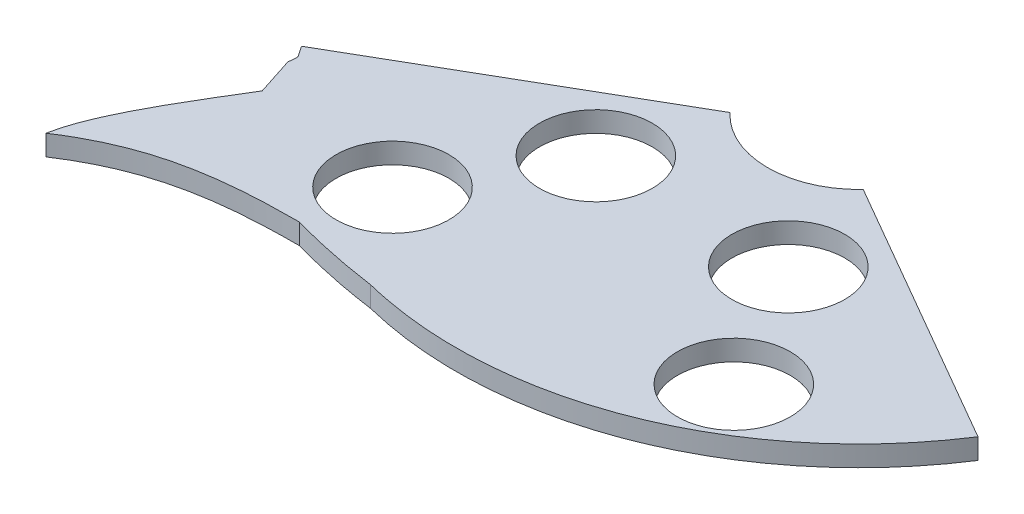
ISO-10303-21;
HEADER;
FILE_DESCRIPTION(('STEP AP214'),'2;1');
FILE_NAME('part.step','',(''),(''),'','','');
FILE_SCHEMA(('AUTOMOTIVE_DESIGN { 1 0 10303 214 1 1 1 1 }'));
ENDSEC;
DATA;
#1=APPLICATION_CONTEXT('core data for automotive mechanical design processes');
#2=APPLICATION_PROTOCOL_DEFINITION('international standard','automotive_design',2000,#1);
#3=PRODUCT_CONTEXT('',#1,'mechanical');
#4=PRODUCT('Part','Part','',(#3));
#5=PRODUCT_RELATED_PRODUCT_CATEGORY('part','',(#4));
#6=PRODUCT_DEFINITION_FORMATION('','',#4);
#7=PRODUCT_DEFINITION_CONTEXT('part definition',#1,'design');
#8=PRODUCT_DEFINITION('design','',#6,#7);
#9=PRODUCT_DEFINITION_SHAPE('','',#8);
#10=(LENGTH_UNIT() NAMED_UNIT(*) SI_UNIT(.MILLI.,.METRE.));
#11=(NAMED_UNIT(*) PLANE_ANGLE_UNIT() SI_UNIT($,.RADIAN.));
#12=(NAMED_UNIT(*) SI_UNIT($,.STERADIAN.) SOLID_ANGLE_UNIT());
#13=UNCERTAINTY_MEASURE_WITH_UNIT(LENGTH_MEASURE(1.E-05),#10,'distance_accuracy_value','');
#14=(GEOMETRIC_REPRESENTATION_CONTEXT(3) GLOBAL_UNCERTAINTY_ASSIGNED_CONTEXT((#13)) GLOBAL_UNIT_ASSIGNED_CONTEXT((#10,
#11,#12)) REPRESENTATION_CONTEXT('',''));
#15=CARTESIAN_POINT('',(0.,0.,0.));
#16=DIRECTION('',(0.,0.,1.));
#17=DIRECTION('',(1.,0.,0.));
#18=AXIS2_PLACEMENT_3D('',#15,#16,#17);
#19=CARTESIAN_POINT('',(-6.86546308041866,-119.736,79.1435924727805));
#20=DIRECTION('',(0.,1.,0.));
#21=DIRECTION('',(0.,0.,1.));
#22=AXIS2_PLACEMENT_3D('',#19,#20,#21);
#23=PLANE('',#22);
#24=CARTESIAN_POINT('',(18.75,-119.736,32.476));
#25=DIRECTION('',(0.,-1.,0.));
#26=DIRECTION('',(0.,0.,-1.));
#27=AXIS2_PLACEMENT_3D('',#24,#25,#26);
#28=CIRCLE('',#27,10.999845998306);
#29=CARTESIAN_POINT('',(18.75,-119.736,21.476154001694));
#30=VERTEX_POINT('',#29);
#31=EDGE_CURVE('E354',#30,#30,#28,.T.);
#32=ORIENTED_EDGE('',*,*,#31,.F.);
#33=EDGE_LOOP('',(#32));
#34=FACE_BOUND('',#33,.T.);
#35=CARTESIAN_POINT('',(-33.25,-119.736,57.591));
#36=DIRECTION('',(0.,-1.,0.));
#37=DIRECTION('',(0.,0.,-1.));
#38=AXIS2_PLACEMENT_3D('',#35,#36,#37);
#39=CIRCLE('',#38,10.999845998306);
#40=CARTESIAN_POINT('',(-33.25,-119.736,46.591154001694));
#41=VERTEX_POINT('',#40);
#42=EDGE_CURVE('E342',#41,#41,#39,.T.);
#43=ORIENTED_EDGE('',*,*,#42,.F.);
#44=EDGE_LOOP('',(#43));
#45=FACE_BOUND('',#44,.T.);
#46=CARTESIAN_POINT('',(-36.4339766689748,-119.736,72.5288613154324));
#47=CARTESIAN_POINT('',(-36.090208175183,-119.736,72.6263250061463));
#48=CARTESIAN_POINT('',(-35.408990523024,-119.736,72.8194627748375));
#49=CARTESIAN_POINT('',(-34.3931059077447,-119.736,73.0944276072982));
#50=CARTESIAN_POINT('',(-33.3936868057941,-119.736,73.3559917423255));
#51=CARTESIAN_POINT('',(-32.410542619546,-119.736,73.6039334399726));
#52=CARTESIAN_POINT('',(-31.4439380081778,-119.736,73.8390468102347));
#53=CARTESIAN_POINT('',(-30.4940427731053,-119.736,74.0618251975522));
#54=CARTESIAN_POINT('',(-29.5610306157385,-119.736,74.2728215662708));
#55=CARTESIAN_POINT('',(-28.6450505128176,-119.736,74.4725604284145));
#56=CARTESIAN_POINT('',(-27.2570964212587,-119.736,74.7643917010507));
#57=CARTESIAN_POINT('',(-25.4225580165016,-119.736,75.1251546210476));
#58=CARTESIAN_POINT('',(-23.1665530380868,-119.736,75.5277459715398));
#59=CARTESIAN_POINT('',(-21.0102525580803,-119.736,75.8799513365268));
#60=CARTESIAN_POINT('',(-19.6041873278216,-119.736,76.0856738966707));
#61=CARTESIAN_POINT('',(-18.9186222511044,-119.736,76.1859794971462));
#62=B_SPLINE_CURVE_WITH_KNOTS('',3,(#46,#47,#48,#49,#50,#51,#52,#53,#54,#55,#56,#57,#58,#59,#60,
#61),.UNSPECIFIED.,.F.,.F.,(4,1,1,1,1,1,1,1,1,1,1,1,1,4),(2.38063851926255,2.44050089938185,
2.49926294797482,2.5569538335641,2.61357512474572,2.66912775865728,2.72361265224791,
2.77703104951304,2.82938450515035,2.88067486393888,3.01464333689576,3.14259742661856,
3.26458921158804,3.38066594991599),.UNSPECIFIED.);
#63=CARTESIAN_POINT('',(-18.9186223045553,-119.736,76.1859798624701));
#64=VERTEX_POINT('',#63);
#65=CARTESIAN_POINT('',(-36.4339766689781,-119.736,72.5288613154428));
#66=VERTEX_POINT('',#65);
#67=EDGE_CURVE('E311',#64,#66,#62,.F.);
#68=ORIENTED_EDGE('',*,*,#67,.T.);
#69=CARTESIAN_POINT('',(-76.1196037393779,-119.736,82.2367438406873));
#70=CARTESIAN_POINT('',(-75.6828937378349,-119.736,81.95336389176));
#71=CARTESIAN_POINT('',(-74.8176335983295,-119.736,81.3918989075016));
#72=CARTESIAN_POINT('',(-73.5052892979913,-119.736,80.5994530897051));
#73=CARTESIAN_POINT('',(-72.1987972246835,-119.736,79.8533061057026));
#74=CARTESIAN_POINT('',(-70.8969004631714,-119.736,79.1556188350504));
#75=CARTESIAN_POINT('',(-69.1650589389726,-119.736,78.2860553036223));
#76=CARTESIAN_POINT('',(-66.9757792636594,-119.736,77.2968295051953));
#77=CARTESIAN_POINT('',(-64.5921226750194,-119.736,76.375802528738));
#78=CARTESIAN_POINT('',(-62.4758692427193,-119.736,75.6678444736838));
#79=CARTESIAN_POINT('',(-59.7691651247279,-119.736,74.8672994946677));
#80=CARTESIAN_POINT('',(-56.0797246277077,-119.736,74.0068584321123));
#81=CARTESIAN_POINT('',(-51.4518642525688,-119.736,73.2789993283885));
#82=CARTESIAN_POINT('',(-46.7344340591599,-119.736,72.8232235757387));
#83=CARTESIAN_POINT('',(-43.1390482250861,-119.736,72.6447150892472));
#84=CARTESIAN_POINT('',(-40.6152740970454,-119.736,72.5747252669947));
#85=CARTESIAN_POINT('',(-39.2284313702309,-119.736,72.548620009672));
#86=CARTESIAN_POINT('',(-37.8337690875411,-119.736,72.5327655940466));
#87=CARTESIAN_POINT('',(-36.9013995312553,-119.736,72.5301648831771));
#88=CARTESIAN_POINT('',(-36.4339766689781,-119.736,72.5288613154428));
#89=B_SPLINE_CURVE_WITH_KNOTS('',3,(#69,#70,#71,#72,#73,#74,#75,#76,#77,#78,#79,#80,#81,#82,#83,
#84,#85,#86,#87,#88),.UNSPECIFIED.,.F.,.F.,(4,1,1,1,1,1,1,1,1,1,1,1,1,1,1,1,1,4),
(4.0523179773988E-06,0.0376172160480558,0.074527583222547,0.110754227177039,0.14631713635095,
0.181237033424669,0.250761520637126,0.319805088134702,0.365778200716289,0.411965678661584,
0.523715454943786,0.639200259777468,0.750209078270335,0.866005219311951,0.899224498910965,
0.932632405241286,0.96622674597806,1.),.UNSPECIFIED.);
#90=CARTESIAN_POINT('',(-76.1196037393779,-119.736,82.2367438406873));
#91=VERTEX_POINT('',#90);
#92=EDGE_CURVE('E104',#66,#91,#89,.F.);
#93=ORIENTED_EDGE('',*,*,#92,.T.);
#94=CARTESIAN_POINT('',(1739.22194511142,-119.736,-754.255930200133));
#95=CARTESIAN_POINT('',(-154.307245408887,-119.736,204.961275522606));
#96=CARTESIAN_POINT('',(-108.258538955282,-119.736,129.504988917175));
#97=CARTESIAN_POINT('',(287.331492542449,-119.736,-518.716363945765));
#98=CARTESIAN_POINT('',(636.872787644068,-119.736,-1091.48147596822));
#99=CARTESIAN_POINT('',(993.135174404048,-119.736,-1644.086992798));
#100=B_SPLINE_CURVE_WITH_KNOTS('',3,(#94,#95,#96,#97,#98,#99),.UNSPECIFIED.,.F.,.F.,(4,2,4),
(-6.34847240769707,0.999520379785779,56.775834920548),.UNSPECIFIED.);
#101=CARTESIAN_POINT('',(-62.2008153900222,-119.736,54.0339267010098));
#102=VERTEX_POINT('',#101);
#103=EDGE_CURVE('E271',#91,#102,#100,.T.);
#104=ORIENTED_EDGE('',*,*,#103,.T.);
#105=DIRECTION('',(-0.30840493395437,0.,-0.951255169085877));
#106=VECTOR('',#105,1.);
#107=CARTESIAN_POINT('',(-64.6157246516883,-119.736,46.5852945129033));
#108=LINE('',#107,#106);
#109=CARTESIAN_POINT('',(-64.6157246516883,-119.736,46.5852945129033));
#110=VERTEX_POINT('',#109);
#111=EDGE_CURVE('E274',#102,#110,#108,.T.);
#112=ORIENTED_EDGE('',*,*,#111,.T.);
#113=CARTESIAN_POINT('',(-64.4649857011341,-119.736,44.7930857181058));
#114=CARTESIAN_POINT('',(-64.4606102922016,-119.736,44.8978814026132));
#115=CARTESIAN_POINT('',(-64.4521154530758,-119.736,45.1013418093316));
#116=CARTESIAN_POINT('',(-64.4541549973613,-119.736,45.397562552258));
#117=CARTESIAN_POINT('',(-64.4674830736292,-119.736,45.674976629803));
#118=CARTESIAN_POINT('',(-64.494116040828,-119.736,45.9507814122414));
#119=CARTESIAN_POINT('',(-64.5282137407988,-119.736,46.1820492350482));
#120=CARTESIAN_POINT('',(-64.5654974869257,-119.736,46.3749906839157));
#121=CARTESIAN_POINT('',(-64.5921209247604,-119.736,46.4933148461406));
#122=CARTESIAN_POINT('',(-64.6100461061515,-119.736,46.5631661969906));
#123=CARTESIAN_POINT('',(-64.6157246516883,-119.736,46.5852945129033));
#124=B_SPLINE_CURVE_WITH_KNOTS('',3,(#113,#114,#115,#116,#117,#118,#119,#120,#121,#122,#123),
.UNSPECIFIED.,.F.,.F.,(4,1,1,1,1,1,1,1,4),(2.85087836116027E-06,0.17425187068453,
0.338309317292824,0.491998190984157,0.635569251516564,0.798537306523809,0.880181233373115,
0.962042430276194,1.),.UNSPECIFIED.);
#125=CARTESIAN_POINT('',(-64.4649857011341,-119.736,44.7930857181058));
#126=VERTEX_POINT('',#125);
#127=EDGE_CURVE('E541',#110,#126,#124,.F.);
#128=ORIENTED_EDGE('',*,*,#127,.T.);
#129=CARTESIAN_POINT('',(0.507975725668061,-119.736,-0.345689997423168));
#130=DIRECTION('',(0.,-1.,0.));
#131=DIRECTION('',(0.,0.,-1.));
#132=AXIS2_PLACEMENT_3D('',#129,#130,#131);
#133=CIRCLE('',#132,79.1138090958701);
#134=CARTESIAN_POINT('',(-65.8942438215736,-119.736,42.6629141284689));
#135=VERTEX_POINT('',#134);
#136=EDGE_CURVE('E542',#126,#135,#133,.T.);
#137=ORIENTED_EDGE('',*,*,#136,.T.);
#138=DIRECTION('',(0.866025113443951,0.,-0.500000502884138));
#139=VECTOR('',#138,1.);
#140=CARTESIAN_POINT('',(-65.8942438215736,-119.736,42.6629141284688));
#141=LINE('',#140,#139);
#142=CARTESIAN_POINT('',(-12.9766531358799,-119.736,12.1108879302399));
#143=VERTEX_POINT('',#142);
#144=EDGE_CURVE('E130',#135,#143,#141,.T.);
#145=ORIENTED_EDGE('',*,*,#144,.T.);
#146=CARTESIAN_POINT('',(0.,-119.736,0.));
#147=DIRECTION('',(0.,1.,0.));
#148=DIRECTION('',(0.,0.,-1.));
#149=AXIS2_PLACEMENT_3D('',#146,#147,#148);
#150=CIRCLE('',#149,17.7501305084715);
#151=CARTESIAN_POINT('',(12.9766531358511,-119.736,12.1108879302707));
#152=VERTEX_POINT('',#151);
#153=EDGE_CURVE('E124',#143,#152,#150,.T.);
#154=ORIENTED_EDGE('',*,*,#153,.T.);
#155=DIRECTION('',(0.866025113442766,0.,0.500000502886192));
#156=VECTOR('',#155,1.);
#157=CARTESIAN_POINT('',(12.9766531358511,-119.736,12.1108879302707));
#158=LINE('',#157,#156);
#159=CARTESIAN_POINT('',(65.8946490574718,-119.736,42.6631480920523));
#160=VERTEX_POINT('',#159);
#161=EDGE_CURVE('E128',#152,#160,#158,.T.);
#162=ORIENTED_EDGE('',*,*,#161,.T.);
#163=CARTESIAN_POINT('',(-18.9186223045553,-119.736,76.1859798624701));
#164=CARTESIAN_POINT('',(-14.9832227890763,-119.736,77.1628806890219));
#165=CARTESIAN_POINT('',(-10.9726298568028,-119.736,77.8348403233372));
#166=CARTESIAN_POINT('',(-2.89512740354942,-119.736,78.5505067471803));
#167=CARTESIAN_POINT('',(1.17241069622407,-119.736,78.5954395830755));
#168=CARTESIAN_POINT('',(9.26266788773931,-119.736,78.0571524350515));
#169=CARTESIAN_POINT('',(13.287983703516,-119.736,77.4729968460706));
#170=CARTESIAN_POINT('',(21.198608359174,-119.736,75.6924384552704));
#171=CARTESIAN_POINT('',(25.0856213113476,-119.736,74.4945528880355));
#172=CARTESIAN_POINT('',(30.7415469371937,-119.736,72.2594617579058));
#173=CARTESIAN_POINT('',(32.5972796978839,-119.736,71.4415633457186));
#174=CARTESIAN_POINT('',(36.2401592680733,-119.736,69.6632416440962));
#175=CARTESIAN_POINT('',(38.0287408030914,-119.736,68.702535587141));
#176=CARTESIAN_POINT('',(41.5256045567289,-119.736,66.6480288365306));
#177=CARTESIAN_POINT('',(43.2324168863246,-119.736,65.554334245886));
#178=CARTESIAN_POINT('',(46.5573871242671,-119.736,63.2352693899852));
#179=CARTESIAN_POINT('',(48.1763106057289,-119.736,62.0102898455667));
#180=CARTESIAN_POINT('',(52.8826504928614,-119.736,58.1562168038565));
#181=CARTESIAN_POINT('',(55.8195127662942,-119.736,55.3443694066233));
#182=CARTESIAN_POINT('',(61.2240291270316,-119.736,49.2997534300691));
#183=CARTESIAN_POINT('',(63.6911393727187,-119.736,46.0668428001472));
#184=CARTESIAN_POINT('',(65.8946490574718,-119.736,42.6631480920523));
#185=B_SPLINE_CURVE_WITH_KNOTS('',3,(#163,#164,#165,#166,#167,#168,#169,#170,#171,#172,#173,
#174,#175,#176,#177,#178,#179,#180,#181,#182,#183,#184),.UNSPECIFIED.,.F.,.F.,(4,2,2,2,2,2,2,2,
2,2,4),(0.,0.125,0.25,0.375,0.5,0.5625,0.625,0.6875,0.75,0.875,1.),.UNSPECIFIED.);
#186=EDGE_CURVE('E53',#160,#64,#185,.F.);
#187=ORIENTED_EDGE('',*,*,#186,.T.);
#188=EDGE_LOOP('',(#68,#93,#104,#112,#128,#137,#145,#154,#162,#187));
#189=FACE_BOUND('',#188,.T.);
#190=CARTESIAN_POINT('',(33.25,-119.736,57.591));
#191=DIRECTION('',(0.,-1.,0.));
#192=DIRECTION('',(0.,0.,-1.));
#193=AXIS2_PLACEMENT_3D('',#190,#191,#192);
#194=CIRCLE('',#193,10.999845998306);
#195=CARTESIAN_POINT('',(33.25,-119.736,46.591154001694));
#196=VERTEX_POINT('',#195);
#197=EDGE_CURVE('E349',#196,#196,#194,.T.);
#198=ORIENTED_EDGE('',*,*,#197,.F.);
#199=EDGE_LOOP('',(#198));
#200=FACE_BOUND('',#199,.T.);
#201=CARTESIAN_POINT('',(-18.75,-119.736,32.476));
#202=DIRECTION('',(0.,-1.,0.));
#203=DIRECTION('',(0.,0.,-1.));
#204=AXIS2_PLACEMENT_3D('',#201,#202,#203);
#205=CIRCLE('',#204,10.999845998306);
#206=CARTESIAN_POINT('',(-18.75,-119.736,21.476154001694));
#207=VERTEX_POINT('',#206);
#208=EDGE_CURVE('E360',#207,#207,#205,.T.);
#209=ORIENTED_EDGE('',*,*,#208,.F.);
#210=EDGE_LOOP('',(#209));
#211=FACE_BOUND('',#210,.T.);
#212=ADVANCED_FACE('F30',(#34,#45,#189,#200,#211),#23,.F.);
#213=CARTESIAN_POINT('',(-6.86546308041866,-115.736,79.1435924727805));
#214=DIRECTION('',(0.,1.,0.));
#215=DIRECTION('',(0.,0.,1.));
#216=AXIS2_PLACEMENT_3D('',#213,#214,#215);
#217=PLANE('',#216);
#218=CARTESIAN_POINT('',(18.75,-115.736,32.476));
#219=DIRECTION('',(0.,-1.,0.));
#220=DIRECTION('',(0.,0.,-1.));
#221=AXIS2_PLACEMENT_3D('',#218,#219,#220);
#222=CIRCLE('',#221,10.999845998306);
#223=CARTESIAN_POINT('',(18.75,-115.736,21.476154001694));
#224=VERTEX_POINT('',#223);
#225=EDGE_CURVE('E357',#224,#224,#222,.T.);
#226=ORIENTED_EDGE('',*,*,#225,.T.);
#227=EDGE_LOOP('',(#226));
#228=FACE_BOUND('',#227,.T.);
#229=CARTESIAN_POINT('',(-33.25,-115.736,57.591));
#230=DIRECTION('',(0.,-1.,0.));
#231=DIRECTION('',(0.,0.,-1.));
#232=AXIS2_PLACEMENT_3D('',#229,#230,#231);
#233=CIRCLE('',#232,10.999845998306);
#234=CARTESIAN_POINT('',(-33.25,-115.736,46.591154001694));
#235=VERTEX_POINT('',#234);
#236=EDGE_CURVE('E344',#235,#235,#233,.T.);
#237=ORIENTED_EDGE('',*,*,#236,.T.);
#238=EDGE_LOOP('',(#237));
#239=FACE_BOUND('',#238,.T.);
#240=CARTESIAN_POINT('',(-18.9186222511044,-115.736,76.1859794971462));
#241=CARTESIAN_POINT('',(-19.6041873278216,-115.736,76.0856738966707));
#242=CARTESIAN_POINT('',(-21.0102525580803,-115.736,75.8799513365268));
#243=CARTESIAN_POINT('',(-23.1665530380868,-115.736,75.5277459715398));
#244=CARTESIAN_POINT('',(-25.4225580165016,-115.736,75.1251546210476));
#245=CARTESIAN_POINT('',(-27.2570964212587,-115.736,74.7643917010507));
#246=CARTESIAN_POINT('',(-28.6450505128176,-115.736,74.4725604284145));
#247=CARTESIAN_POINT('',(-29.5610306157385,-115.736,74.2728215662708));
#248=CARTESIAN_POINT('',(-30.4940427731053,-115.736,74.0618251975522));
#249=CARTESIAN_POINT('',(-31.4439380081778,-115.736,73.8390468102347));
#250=CARTESIAN_POINT('',(-32.410542619546,-115.736,73.6039334399726));
#251=CARTESIAN_POINT('',(-33.3936868057941,-115.736,73.3559917423255));
#252=CARTESIAN_POINT('',(-34.3931059077447,-115.736,73.0944276072982));
#253=CARTESIAN_POINT('',(-35.408990523024,-115.736,72.8194627748375));
#254=CARTESIAN_POINT('',(-36.090208175183,-115.736,72.6263250061463));
#255=CARTESIAN_POINT('',(-36.4339766689748,-115.736,72.5288613154324));
#256=B_SPLINE_CURVE_WITH_KNOTS('',3,(#240,#241,#242,#243,#244,#245,#246,#247,#248,#249,#250,
#251,#252,#253,#254,#255),.UNSPECIFIED.,.F.,.F.,(4,1,1,1,1,1,1,1,1,1,1,1,1,4),(2.38063851926255,
2.4967152575905,2.61870704255998,2.74666113228279,2.88062960523966,2.93191996402819,
2.9842734196655,3.03769181693063,3.09217671052126,3.14772934443283,3.20435063561445,
3.26204152120373,3.32080356979669,3.38066594991599),.UNSPECIFIED.);
#257=CARTESIAN_POINT('',(-18.9186223045553,-115.736,76.1859798624701));
#258=VERTEX_POINT('',#257);
#259=CARTESIAN_POINT('',(-36.4339766689781,-115.736,72.5288613154428));
#260=VERTEX_POINT('',#259);
#261=EDGE_CURVE('E333',#258,#260,#256,.T.);
#262=ORIENTED_EDGE('',*,*,#261,.F.);
#263=CARTESIAN_POINT('',(65.8946490574718,-115.736,42.6631480920523));
#264=CARTESIAN_POINT('',(63.6911393727187,-115.736,46.0668428001472));
#265=CARTESIAN_POINT('',(61.2240291270316,-115.736,49.2997534300691));
#266=CARTESIAN_POINT('',(55.8195127662942,-115.736,55.3443694066233));
#267=CARTESIAN_POINT('',(52.8826504928614,-115.736,58.1562168038565));
#268=CARTESIAN_POINT('',(48.1763106057289,-115.736,62.0102898455667));
#269=CARTESIAN_POINT('',(46.5573871242671,-115.736,63.2352693899852));
#270=CARTESIAN_POINT('',(43.2324168863246,-115.736,65.554334245886));
#271=CARTESIAN_POINT('',(41.5256045567289,-115.736,66.6480288365306));
#272=CARTESIAN_POINT('',(38.0287408030914,-115.736,68.702535587141));
#273=CARTESIAN_POINT('',(36.2401592680733,-115.736,69.6632416440962));
#274=CARTESIAN_POINT('',(32.5972796978839,-115.736,71.4415633457186));
#275=CARTESIAN_POINT('',(30.7415469371937,-115.736,72.2594617579058));
#276=CARTESIAN_POINT('',(25.0856213113476,-115.736,74.4945528880355));
#277=CARTESIAN_POINT('',(21.198608359174,-115.736,75.6924384552704));
#278=CARTESIAN_POINT('',(13.287983703516,-115.736,77.4729968460706));
#279=CARTESIAN_POINT('',(9.26266788773931,-115.736,78.0571524350515));
#280=CARTESIAN_POINT('',(1.17241069622407,-115.736,78.5954395830755));
#281=CARTESIAN_POINT('',(-2.89512740354942,-115.736,78.5505067471803));
#282=CARTESIAN_POINT('',(-10.9726298568028,-115.736,77.8348403233372));
#283=CARTESIAN_POINT('',(-14.9832227890763,-115.736,77.1628806890219));
#284=CARTESIAN_POINT('',(-18.9186223045553,-115.736,76.1859798624701));
#285=B_SPLINE_CURVE_WITH_KNOTS('',3,(#263,#264,#265,#266,#267,#268,#269,#270,#271,#272,#273,
#274,#275,#276,#277,#278,#279,#280,#281,#282,#283,#284),.UNSPECIFIED.,.F.,.F.,(4,2,2,2,2,2,2,2,
2,2,4),(0.,0.125,0.25,0.3125,0.375,0.4375,0.5,0.625,0.75,0.875,1.),.UNSPECIFIED.);
#286=CARTESIAN_POINT('',(65.8946490574718,-115.736,42.6631480920523));
#287=VERTEX_POINT('',#286);
#288=EDGE_CURVE('E95',#287,#258,#285,.T.);
#289=ORIENTED_EDGE('',*,*,#288,.F.);
#290=DIRECTION('',(0.866025113442766,0.,0.500000502886192));
#291=VECTOR('',#290,1.);
#292=CARTESIAN_POINT('',(12.9766531358511,-115.736,12.1108879302707));
#293=LINE('',#292,#291);
#294=CARTESIAN_POINT('',(12.9766531358511,-115.736,12.1108879302707));
#295=VERTEX_POINT('',#294);
#296=EDGE_CURVE('E89',#295,#287,#293,.T.);
#297=ORIENTED_EDGE('',*,*,#296,.F.);
#298=CARTESIAN_POINT('',(0.,-115.736,0.));
#299=DIRECTION('',(0.,1.,0.));
#300=DIRECTION('',(0.,0.,-1.));
#301=AXIS2_PLACEMENT_3D('',#298,#299,#300);
#302=CIRCLE('',#301,17.7501305084715);
#303=CARTESIAN_POINT('',(-12.9766531358799,-115.736,12.1108879302399));
#304=VERTEX_POINT('',#303);
#305=EDGE_CURVE('E138',#304,#295,#302,.T.);
#306=ORIENTED_EDGE('',*,*,#305,.F.);
#307=DIRECTION('',(0.866025113443951,0.,-0.500000502884138));
#308=VECTOR('',#307,1.);
#309=CARTESIAN_POINT('',(-65.8942438215736,-115.736,42.6629141284688));
#310=LINE('',#309,#308);
#311=CARTESIAN_POINT('',(-65.8942438215736,-115.736,42.6629141284689));
#312=VERTEX_POINT('',#311);
#313=EDGE_CURVE('E184',#312,#304,#310,.T.);
#314=ORIENTED_EDGE('',*,*,#313,.F.);
#315=CARTESIAN_POINT('',(0.507975725668061,-115.736,-0.345689997423168));
#316=DIRECTION('',(0.,-1.,0.));
#317=DIRECTION('',(0.,0.,-1.));
#318=AXIS2_PLACEMENT_3D('',#315,#316,#317);
#319=CIRCLE('',#318,79.1138090958701);
#320=CARTESIAN_POINT('',(-64.4649857011341,-115.736,44.7930857181058));
#321=VERTEX_POINT('',#320);
#322=EDGE_CURVE('E189',#321,#312,#319,.T.);
#323=ORIENTED_EDGE('',*,*,#322,.F.);
#324=CARTESIAN_POINT('',(-64.6157246516883,-115.736,46.5852945129033));
#325=CARTESIAN_POINT('',(-64.6100461061515,-115.736,46.5631661969906));
#326=CARTESIAN_POINT('',(-64.5921209247604,-115.736,46.4933148461406));
#327=CARTESIAN_POINT('',(-64.5654974869257,-115.736,46.3749906839157));
#328=CARTESIAN_POINT('',(-64.5282137407988,-115.736,46.1820492350482));
#329=CARTESIAN_POINT('',(-64.494116040828,-115.736,45.9507814122414));
#330=CARTESIAN_POINT('',(-64.4674830736292,-115.736,45.674976629803));
#331=CARTESIAN_POINT('',(-64.4541549973613,-115.736,45.397562552258));
#332=CARTESIAN_POINT('',(-64.4521154530758,-115.736,45.1013418093316));
#333=CARTESIAN_POINT('',(-64.4606102922016,-115.736,44.8978814026132));
#334=CARTESIAN_POINT('',(-64.4649857011341,-115.736,44.7930857181058));
#335=B_SPLINE_CURVE_WITH_KNOTS('',3,(#324,#325,#326,#327,#328,#329,#330,#331,#332,#333,#334),
.UNSPECIFIED.,.F.,.F.,(4,1,1,1,1,1,1,1,4),(2.85087836112081E-06,0.0379604206021675,
0.119821617505246,0.201465544354552,0.364433599361797,0.508004659894204,0.661693533585537,
0.825750980193831,1.),.UNSPECIFIED.);
#336=CARTESIAN_POINT('',(-64.6157246516883,-115.736,46.5852945129033));
#337=VERTEX_POINT('',#336);
#338=EDGE_CURVE('E520',#337,#321,#335,.T.);
#339=ORIENTED_EDGE('',*,*,#338,.F.);
#340=DIRECTION('',(-0.30840493395437,0.,-0.951255169085877));
#341=VECTOR('',#340,1.);
#342=CARTESIAN_POINT('',(-64.6157246516883,-115.736,46.5852945129033));
#343=LINE('',#342,#341);
#344=CARTESIAN_POINT('',(-62.2008153900222,-115.736,54.0339267010098));
#345=VERTEX_POINT('',#344);
#346=EDGE_CURVE('E302',#345,#337,#343,.T.);
#347=ORIENTED_EDGE('',*,*,#346,.F.);
#348=CARTESIAN_POINT('',(1739.22194511142,-115.736,-754.255930200133));
#349=CARTESIAN_POINT('',(-154.307245408887,-115.736,204.961275522606));
#350=CARTESIAN_POINT('',(-108.258538955282,-115.736,129.504988917175));
#351=CARTESIAN_POINT('',(287.331492542449,-115.736,-518.716363945765));
#352=CARTESIAN_POINT('',(636.872787644068,-115.736,-1091.48147596822));
#353=CARTESIAN_POINT('',(993.135174404048,-115.736,-1644.086992798));
#354=B_SPLINE_CURVE_WITH_KNOTS('',3,(#348,#349,#350,#351,#352,#353),.UNSPECIFIED.,.F.,.F.,(4,2,
4),(-6.34847240769707,0.999520379785779,56.775834920548),.UNSPECIFIED.);
#355=CARTESIAN_POINT('',(-76.1196037393779,-115.736,82.2367438406873));
#356=VERTEX_POINT('',#355);
#357=EDGE_CURVE('E295',#356,#345,#354,.T.);
#358=ORIENTED_EDGE('',*,*,#357,.F.);
#359=CARTESIAN_POINT('',(-36.4339766689781,-115.736,72.5288613154428));
#360=CARTESIAN_POINT('',(-36.9013995312553,-115.736,72.5301648831771));
#361=CARTESIAN_POINT('',(-37.8337690875411,-115.736,72.5327655940466));
#362=CARTESIAN_POINT('',(-39.2284313702309,-115.736,72.548620009672));
#363=CARTESIAN_POINT('',(-40.6152740970454,-115.736,72.5747252669947));
#364=CARTESIAN_POINT('',(-43.1390482250861,-115.736,72.6447150892472));
#365=CARTESIAN_POINT('',(-46.7344340591599,-115.736,72.8232235757387));
#366=CARTESIAN_POINT('',(-51.4518642525688,-115.736,73.2789993283885));
#367=CARTESIAN_POINT('',(-56.0797246277077,-115.736,74.0068584321123));
#368=CARTESIAN_POINT('',(-59.7691651247279,-115.736,74.8672994946677));
#369=CARTESIAN_POINT('',(-62.4758692427193,-115.736,75.6678444736838));
#370=CARTESIAN_POINT('',(-64.5921226750194,-115.736,76.375802528738));
#371=CARTESIAN_POINT('',(-66.9757792636594,-115.736,77.2968295051953));
#372=CARTESIAN_POINT('',(-69.1650589389726,-115.736,78.2860553036223));
#373=CARTESIAN_POINT('',(-70.8969004631714,-115.736,79.1556188350504));
#374=CARTESIAN_POINT('',(-72.1987972246835,-115.736,79.8533061057026));
#375=CARTESIAN_POINT('',(-73.5052892979913,-115.736,80.5994530897051));
#376=CARTESIAN_POINT('',(-74.8176335983295,-115.736,81.3918989075016));
#377=CARTESIAN_POINT('',(-75.6828937378349,-115.736,81.95336389176));
#378=CARTESIAN_POINT('',(-76.1196037393779,-115.736,82.2367438406873));
#379=B_SPLINE_CURVE_WITH_KNOTS('',3,(#359,#360,#361,#362,#363,#364,#365,#366,#367,#368,#369,
#370,#371,#372,#373,#374,#375,#376,#377,#378),.UNSPECIFIED.,.F.,.F.,(4,1,1,1,1,1,1,1,1,1,1,1,1,
1,1,1,1,4),(4.05231797743373E-06,0.0337773063399178,0.0673716470766914,0.100779553407012,
0.133998833006027,0.249794974047643,0.36080379254051,0.476288597374191,0.588038373656393,
0.634225851601688,0.680198964183276,0.749242531680851,0.818767018893309,0.853686915967027,
0.889249825140939,0.92547646909543,0.962386836269922,1.),.UNSPECIFIED.);
#380=EDGE_CURVE('E278',#260,#356,#379,.T.);
#381=ORIENTED_EDGE('',*,*,#380,.F.);
#382=EDGE_LOOP('',(#262,#289,#297,#306,#314,#323,#339,#347,#358,#381));
#383=FACE_BOUND('',#382,.T.);
#384=CARTESIAN_POINT('',(33.25,-115.736,57.591));
#385=DIRECTION('',(0.,-1.,0.));
#386=DIRECTION('',(0.,0.,-1.));
#387=AXIS2_PLACEMENT_3D('',#384,#385,#386);
#388=CIRCLE('',#387,10.999845998306);
#389=CARTESIAN_POINT('',(33.25,-115.736,46.591154001694));
#390=VERTEX_POINT('',#389);
#391=EDGE_CURVE('E351',#390,#390,#388,.T.);
#392=ORIENTED_EDGE('',*,*,#391,.T.);
#393=EDGE_LOOP('',(#392));
#394=FACE_BOUND('',#393,.T.);
#395=CARTESIAN_POINT('',(-18.75,-115.736,32.476));
#396=DIRECTION('',(0.,-1.,0.));
#397=DIRECTION('',(0.,0.,-1.));
#398=AXIS2_PLACEMENT_3D('',#395,#396,#397);
#399=CIRCLE('',#398,10.999845998306);
#400=CARTESIAN_POINT('',(-18.75,-115.736,21.476154001694));
#401=VERTEX_POINT('',#400);
#402=EDGE_CURVE('E363',#401,#401,#399,.T.);
#403=ORIENTED_EDGE('',*,*,#402,.T.);
#404=EDGE_LOOP('',(#403));
#405=FACE_BOUND('',#404,.T.);
#406=ADVANCED_FACE('F174',(#228,#239,#383,#394,#405),#217,.T.);
#407=CARTESIAN_POINT('',(-173.967771816631,-119.736,2068.23049165742));
#408=CARTESIAN_POINT('',(81.7176754723844,-119.736,62.4533364639477));
#409=CARTESIAN_POINT('',(27.4043262965455,-119.736,83.7878818750993));
#410=CARTESIAN_POINT('',(-23.1665530380868,-119.736,75.5277459715398));
#411=CARTESIAN_POINT('',(-25.4225580165016,-119.736,75.1251546210476));
#412=CARTESIAN_POINT('',(-27.2570964212587,-119.736,74.7643917010507));
#413=CARTESIAN_POINT('',(-28.6450505128176,-119.736,74.4725604284145));
#414=CARTESIAN_POINT('',(-29.5610306157385,-119.736,74.2728215662708));
#415=CARTESIAN_POINT('',(-30.4940427731053,-119.736,74.0618251975522));
#416=CARTESIAN_POINT('',(-31.4439380081778,-119.736,73.8390468102347));
#417=CARTESIAN_POINT('',(-32.410542619546,-119.736,73.6039334399726));
#418=CARTESIAN_POINT('',(-33.3936868057941,-119.736,73.3559917423255));
#419=CARTESIAN_POINT('',(-34.3931059077447,-119.736,73.0944276072982));
#420=CARTESIAN_POINT('',(-69.0431904166451,-119.736,63.7158480536353));
#421=CARTESIAN_POINT('',(-97.6468183622476,-119.736,33.9003805164372));
#422=CARTESIAN_POINT('',(-672.48682192348,-119.736,1967.66197342798));
#423=B_SPLINE_CURVE_WITH_KNOTS('',3,(#407,#408,#409,#410,#411,#412,#413,#414,#415,#416,#417,
#418,#419,#420,#421,#422),.UNSPECIFIED.,.F.,.F.,(4,1,1,1,1,1,1,1,1,1,1,1,1,4),
(-5.83752533357459,2.4967152575905,2.61870704255998,2.74666113228279,2.88062960523966,
2.93191996402819,2.9842734196655,3.03769181693063,3.09217671052126,3.14772934443283,
3.20435063561445,3.26204152120373,3.32080356979669,9.21816406370978),.UNSPECIFIED.);
#424=DIRECTION('',(0.,1.,0.));
#425=VECTOR('',#424,1.);
#426=SURFACE_OF_LINEAR_EXTRUSION('',#423,#425);
#427=ORIENTED_EDGE('',*,*,#261,.T.);
#428=DIRECTION('',(0.,1.,0.));
#429=VECTOR('',#428,1.);
#430=CARTESIAN_POINT('',(-36.4339766689781,-119.736,72.5288613154428));
#431=LINE('',#430,#429);
#432=EDGE_CURVE('E11',#66,#260,#431,.T.);
#433=ORIENTED_EDGE('',*,*,#432,.F.);
#434=ORIENTED_EDGE('',*,*,#67,.F.);
#435=DIRECTION('',(0.,1.,0.));
#436=VECTOR('',#435,1.);
#437=CARTESIAN_POINT('',(-18.9186223045553,-119.736,76.1859798624701));
#438=LINE('',#437,#436);
#439=EDGE_CURVE('E144',#64,#258,#438,.T.);
#440=ORIENTED_EDGE('',*,*,#439,.T.);
#441=EDGE_LOOP('',(#427,#433,#434,#440));
#442=FACE_BOUND('',#441,.T.);
#443=ADVANCED_FACE('F32',(#442),#426,.F.);
#444=CARTESIAN_POINT('',(-36.4338084163661,-119.736,72.5288608462131));
#445=CARTESIAN_POINT('',(-36.9012873628475,-119.736,72.5301645703283));
#446=CARTESIAN_POINT('',(-37.8337130063013,-119.736,72.5327649565193));
#447=CARTESIAN_POINT('',(-39.2284313702309,-119.736,72.548620009672));
#448=CARTESIAN_POINT('',(-40.6152740970454,-119.736,72.5747252669947));
#449=CARTESIAN_POINT('',(-43.1390482250861,-119.736,72.6447150892472));
#450=CARTESIAN_POINT('',(-46.7344340591599,-119.736,72.8232235757387));
#451=CARTESIAN_POINT('',(-51.4518642525688,-119.736,73.2789993283885));
#452=CARTESIAN_POINT('',(-56.0797246277077,-119.736,74.0068584321123));
#453=CARTESIAN_POINT('',(-59.7691651247279,-119.736,74.8672994946677));
#454=CARTESIAN_POINT('',(-62.4758692427193,-119.736,75.6678444736838));
#455=CARTESIAN_POINT('',(-64.5921226750194,-119.736,76.375802528738));
#456=CARTESIAN_POINT('',(-66.9757792636594,-119.736,77.2968295051953));
#457=CARTESIAN_POINT('',(-69.1650589389726,-119.736,78.2860553036223));
#458=CARTESIAN_POINT('',(-70.8969004631714,-119.736,79.1556188350504));
#459=CARTESIAN_POINT('',(-72.1987972246835,-119.736,79.8533061057026));
#460=CARTESIAN_POINT('',(-73.5052892979913,-119.736,80.5994530897051));
#461=CARTESIAN_POINT('',(-74.8176335983295,-119.736,81.3918989075016));
#462=CARTESIAN_POINT('',(-75.6828937378349,-119.736,81.95336389176));
#463=CARTESIAN_POINT('',(-76.1196037393779,-119.736,82.2367438406873));
#464=B_SPLINE_CURVE_WITH_KNOTS('',3,(#444,#445,#446,#447,#448,#449,#450,#451,#452,#453,#454,
#455,#456,#457,#458,#459,#460,#461,#462,#463),.UNSPECIFIED.,.F.,.F.,(4,1,1,1,1,1,1,1,1,1,1,1,1,
1,1,1,1,4),(0.,0.0337773063399178,0.0673716470766914,0.100779553407012,0.133998833006027,
0.249794974047643,0.36080379254051,0.476288597374191,0.588038373656393,0.634225851601688,
0.680198964183276,0.749242531680851,0.818767018893309,0.853686915967027,0.889249825140939,
0.92547646909543,0.962386836269922,1.),.UNSPECIFIED.);
#465=DIRECTION('',(0.,1.,0.));
#466=VECTOR('',#465,1.);
#467=SURFACE_OF_LINEAR_EXTRUSION('',#464,#466);
#468=ORIENTED_EDGE('',*,*,#380,.T.);
#469=DIRECTION('',(0.,1.,0.));
#470=VECTOR('',#469,1.);
#471=CARTESIAN_POINT('',(-76.1196037393779,-119.736,82.2367438406873));
#472=LINE('',#471,#470);
#473=EDGE_CURVE('E44',#91,#356,#472,.T.);
#474=ORIENTED_EDGE('',*,*,#473,.F.);
#475=ORIENTED_EDGE('',*,*,#92,.F.);
#476=ORIENTED_EDGE('',*,*,#432,.T.);
#477=EDGE_LOOP('',(#468,#474,#475,#476));
#478=FACE_BOUND('',#477,.T.);
#479=ADVANCED_FACE('F235',(#478),#467,.F.);
#480=DIRECTION('',(0.,1.,0.));
#481=VECTOR('',#480,1.);
#482=SURFACE_OF_LINEAR_EXTRUSION('',#100,#481);
#483=ORIENTED_EDGE('',*,*,#357,.T.);
#484=DIRECTION('',(0.,1.,0.));
#485=VECTOR('',#484,1.);
#486=CARTESIAN_POINT('',(-62.2008153900222,-119.736,54.0339267010098));
#487=LINE('',#486,#485);
#488=EDGE_CURVE('E196',#102,#345,#487,.T.);
#489=ORIENTED_EDGE('',*,*,#488,.F.);
#490=ORIENTED_EDGE('',*,*,#103,.F.);
#491=ORIENTED_EDGE('',*,*,#473,.T.);
#492=EDGE_LOOP('',(#483,#489,#490,#491));
#493=FACE_BOUND('',#492,.T.);
#494=ADVANCED_FACE('F245',(#493),#482,.F.);
#495=CARTESIAN_POINT('',(-64.6157246516883,-119.736,46.5852945129033));
#496=DIRECTION('',(0.951255169085877,0.,-0.30840493395437));
#497=DIRECTION('',(-0.30840493395437,0.,-0.951255169085877));
#498=AXIS2_PLACEMENT_3D('',#495,#496,#497);
#499=PLANE('',#498);
#500=ORIENTED_EDGE('',*,*,#346,.T.);
#501=DIRECTION('',(0.,1.,0.));
#502=VECTOR('',#501,1.);
#503=CARTESIAN_POINT('',(-64.6157246516883,-119.736,46.5852945129033));
#504=LINE('',#503,#502);
#505=EDGE_CURVE('E198',#110,#337,#504,.T.);
#506=ORIENTED_EDGE('',*,*,#505,.F.);
#507=ORIENTED_EDGE('',*,*,#111,.F.);
#508=ORIENTED_EDGE('',*,*,#488,.T.);
#509=EDGE_LOOP('',(#500,#506,#507,#508));
#510=FACE_BOUND('',#509,.T.);
#511=ADVANCED_FACE('F474',(#510),#499,.F.);
#512=CARTESIAN_POINT('',(-64.6157246516883,-119.736,46.5852945129033));
#513=CARTESIAN_POINT('',(-64.6100461061515,-119.736,46.5631661969906));
#514=CARTESIAN_POINT('',(-64.5921209247604,-119.736,46.4933148461406));
#515=CARTESIAN_POINT('',(-64.5654974869257,-119.736,46.3749906839157));
#516=CARTESIAN_POINT('',(-64.5282137407988,-119.736,46.1820492350482));
#517=CARTESIAN_POINT('',(-64.494116040828,-119.736,45.9507814122414));
#518=CARTESIAN_POINT('',(-64.4674830736292,-119.736,45.674976629803));
#519=CARTESIAN_POINT('',(-64.4541549973613,-119.736,45.397562552258));
#520=CARTESIAN_POINT('',(-64.4521154530758,-119.736,45.1013418093316));
#521=CARTESIAN_POINT('',(-64.4606102922016,-119.736,44.8978814026132));
#522=CARTESIAN_POINT('',(-64.4649857011341,-119.736,44.7930857181058));
#523=B_SPLINE_CURVE_WITH_KNOTS('',3,(#512,#513,#514,#515,#516,#517,#518,#519,#520,#521,#522),
.UNSPECIFIED.,.F.,.F.,(4,1,1,1,1,1,1,1,4),(2.85087836112081E-06,0.0379604206021675,
0.119821617505246,0.201465544354552,0.364433599361797,0.508004659894204,0.661693533585537,
0.825750980193831,1.),.UNSPECIFIED.);
#524=DIRECTION('',(0.,1.,0.));
#525=VECTOR('',#524,1.);
#526=SURFACE_OF_LINEAR_EXTRUSION('',#523,#525);
#527=ORIENTED_EDGE('',*,*,#338,.T.);
#528=DIRECTION('',(0.,1.,0.));
#529=VECTOR('',#528,1.);
#530=CARTESIAN_POINT('',(-64.4649857011341,-119.736,44.7930857181058));
#531=LINE('',#530,#529);
#532=EDGE_CURVE('E195',#126,#321,#531,.T.);
#533=ORIENTED_EDGE('',*,*,#532,.F.);
#534=ORIENTED_EDGE('',*,*,#127,.F.);
#535=ORIENTED_EDGE('',*,*,#505,.T.);
#536=EDGE_LOOP('',(#527,#533,#534,#535));
#537=FACE_BOUND('',#536,.T.);
#538=ADVANCED_FACE('F465',(#537),#526,.F.);
#539=CARTESIAN_POINT('',(0.507975725668061,-119.736,-0.345689997423168));
#540=DIRECTION('',(0.,1.,0.));
#541=DIRECTION('',(0.,0.,1.));
#542=AXIS2_PLACEMENT_3D('',#539,#540,#541);
#543=CYLINDRICAL_SURFACE('',#542,79.1138090958701);
#544=ORIENTED_EDGE('',*,*,#322,.T.);
#545=DIRECTION('',(0.,1.,0.));
#546=VECTOR('',#545,1.);
#547=CARTESIAN_POINT('',(-65.8942438215736,-119.736,42.6629141284689));
#548=LINE('',#547,#546);
#549=EDGE_CURVE('E192',#135,#312,#548,.T.);
#550=ORIENTED_EDGE('',*,*,#549,.F.);
#551=ORIENTED_EDGE('',*,*,#136,.F.);
#552=ORIENTED_EDGE('',*,*,#532,.T.);
#553=EDGE_LOOP('',(#544,#550,#551,#552));
#554=FACE_BOUND('',#553,.T.);
#555=ADVANCED_FACE('F456',(#554),#543,.T.);
#556=CARTESIAN_POINT('',(-65.8942438215736,-119.736,42.6629141284688));
#557=DIRECTION('',(0.500000502884138,0.,0.866025113443951));
#558=DIRECTION('',(0.866025113443951,0.,-0.500000502884138));
#559=AXIS2_PLACEMENT_3D('',#556,#557,#558);
#560=PLANE('',#559);
#561=ORIENTED_EDGE('',*,*,#313,.T.);
#562=DIRECTION('',(0.,1.,0.));
#563=VECTOR('',#562,1.);
#564=CARTESIAN_POINT('',(-12.9766531358799,-119.736,12.1108879302399));
#565=LINE('',#564,#563);
#566=EDGE_CURVE('E139',#143,#304,#565,.T.);
#567=ORIENTED_EDGE('',*,*,#566,.F.);
#568=ORIENTED_EDGE('',*,*,#144,.F.);
#569=ORIENTED_EDGE('',*,*,#549,.T.);
#570=EDGE_LOOP('',(#561,#567,#568,#569));
#571=FACE_BOUND('',#570,.T.);
#572=ADVANCED_FACE('F449',(#571),#560,.F.);
#573=CARTESIAN_POINT('',(0.,-119.736,0.));
#574=DIRECTION('',(0.,1.,0.));
#575=DIRECTION('',(0.,0.,1.));
#576=AXIS2_PLACEMENT_3D('',#573,#574,#575);
#577=CYLINDRICAL_SURFACE('',#576,17.7501305084715);
#578=ORIENTED_EDGE('',*,*,#305,.T.);
#579=DIRECTION('',(0.,1.,0.));
#580=VECTOR('',#579,1.);
#581=CARTESIAN_POINT('',(12.9766531358511,-119.736,12.1108879302707));
#582=LINE('',#581,#580);
#583=EDGE_CURVE('E135',#152,#295,#582,.T.);
#584=ORIENTED_EDGE('',*,*,#583,.F.);
#585=ORIENTED_EDGE('',*,*,#153,.F.);
#586=ORIENTED_EDGE('',*,*,#566,.T.);
#587=EDGE_LOOP('',(#578,#584,#585,#586));
#588=FACE_BOUND('',#587,.T.);
#589=ADVANCED_FACE('F136',(#588),#577,.F.);
#590=CARTESIAN_POINT('',(12.9766531358511,-119.736,12.1108879302707));
#591=DIRECTION('',(-0.500000502886192,0.,0.866025113442766));
#592=DIRECTION('',(0.866025113442766,0.,0.500000502886192));
#593=AXIS2_PLACEMENT_3D('',#590,#591,#592);
#594=PLANE('',#593);
#595=ORIENTED_EDGE('',*,*,#296,.T.);
#596=DIRECTION('',(0.,1.,0.));
#597=VECTOR('',#596,1.);
#598=CARTESIAN_POINT('',(65.8946490574718,-119.736,42.6631480920523));
#599=LINE('',#598,#597);
#600=EDGE_CURVE('E140',#160,#287,#599,.T.);
#601=ORIENTED_EDGE('',*,*,#600,.F.);
#602=ORIENTED_EDGE('',*,*,#161,.F.);
#603=ORIENTED_EDGE('',*,*,#583,.T.);
#604=EDGE_LOOP('',(#595,#601,#602,#603));
#605=FACE_BOUND('',#604,.T.);
#606=ADVANCED_FACE('F142',(#605),#594,.F.);
#607=CARTESIAN_POINT('',(65.8946490574718,-119.736,42.6631480920523));
#608=CARTESIAN_POINT('',(63.6911393727187,-119.736,46.0668428001472));
#609=CARTESIAN_POINT('',(61.2240291270316,-119.736,49.2997534300691));
#610=CARTESIAN_POINT('',(55.8195127662942,-119.736,55.3443694066233));
#611=CARTESIAN_POINT('',(52.8826504928614,-119.736,58.1562168038565));
#612=CARTESIAN_POINT('',(48.1763106057289,-119.736,62.0102898455667));
#613=CARTESIAN_POINT('',(46.5573871242671,-119.736,63.2352693899852));
#614=CARTESIAN_POINT('',(43.2324168863246,-119.736,65.554334245886));
#615=CARTESIAN_POINT('',(41.5256045567289,-119.736,66.6480288365306));
#616=CARTESIAN_POINT('',(38.0287408030914,-119.736,68.702535587141));
#617=CARTESIAN_POINT('',(36.2401592680733,-119.736,69.6632416440962));
#618=CARTESIAN_POINT('',(32.5972796978839,-119.736,71.4415633457186));
#619=CARTESIAN_POINT('',(30.7415469371937,-119.736,72.2594617579058));
#620=CARTESIAN_POINT('',(25.0856213113476,-119.736,74.4945528880355));
#621=CARTESIAN_POINT('',(21.198608359174,-119.736,75.6924384552704));
#622=CARTESIAN_POINT('',(13.287983703516,-119.736,77.4729968460706));
#623=CARTESIAN_POINT('',(9.26266788773931,-119.736,78.0571524350515));
#624=CARTESIAN_POINT('',(1.17241069622407,-119.736,78.5954395830755));
#625=CARTESIAN_POINT('',(-2.89512740354942,-119.736,78.5505067471803));
#626=CARTESIAN_POINT('',(-10.9726298568028,-119.736,77.8348403233372));
#627=CARTESIAN_POINT('',(-14.9832227890763,-119.736,77.1628806890219));
#628=CARTESIAN_POINT('',(-18.9186223045553,-119.736,76.1859798624701));
#629=B_SPLINE_CURVE_WITH_KNOTS('',3,(#607,#608,#609,#610,#611,#612,#613,#614,#615,#616,#617,
#618,#619,#620,#621,#622,#623,#624,#625,#626,#627,#628),.UNSPECIFIED.,.F.,.F.,(4,2,2,2,2,2,2,2,
2,2,4),(0.,0.125,0.25,0.3125,0.375,0.4375,0.5,0.625,0.75,0.875,1.),.UNSPECIFIED.);
#630=DIRECTION('',(0.,1.,0.));
#631=VECTOR('',#630,1.);
#632=SURFACE_OF_LINEAR_EXTRUSION('',#629,#631);
#633=ORIENTED_EDGE('',*,*,#288,.T.);
#634=ORIENTED_EDGE('',*,*,#439,.F.);
#635=ORIENTED_EDGE('',*,*,#186,.F.);
#636=ORIENTED_EDGE('',*,*,#600,.T.);
#637=EDGE_LOOP('',(#633,#634,#635,#636));
#638=FACE_BOUND('',#637,.T.);
#639=ADVANCED_FACE('F163',(#638),#632,.F.);
#640=CARTESIAN_POINT('',(-33.25,-119.736,57.591));
#641=DIRECTION('',(0.,1.,0.));
#642=DIRECTION('',(0.,0.,1.));
#643=AXIS2_PLACEMENT_3D('',#640,#641,#642);
#644=CYLINDRICAL_SURFACE('',#643,10.999845998306);
#645=ORIENTED_EDGE('',*,*,#42,.T.);
#646=EDGE_LOOP('',(#645));
#647=FACE_BOUND('',#646,.T.);
#648=ORIENTED_EDGE('',*,*,#236,.F.);
#649=EDGE_LOOP('',(#648));
#650=FACE_BOUND('',#649,.T.);
#651=ADVANCED_FACE('F173',(#647,#650),#644,.F.);
#652=CARTESIAN_POINT('',(33.25,-119.736,57.591));
#653=DIRECTION('',(0.,1.,0.));
#654=DIRECTION('',(0.,0.,1.));
#655=AXIS2_PLACEMENT_3D('',#652,#653,#654);
#656=CYLINDRICAL_SURFACE('',#655,10.999845998306);
#657=ORIENTED_EDGE('',*,*,#197,.T.);
#658=EDGE_LOOP('',(#657));
#659=FACE_BOUND('',#658,.T.);
#660=ORIENTED_EDGE('',*,*,#391,.F.);
#661=EDGE_LOOP('',(#660));
#662=FACE_BOUND('',#661,.T.);
#663=ADVANCED_FACE('F387',(#659,#662),#656,.F.);
#664=CARTESIAN_POINT('',(18.75,-119.736,32.476));
#665=DIRECTION('',(0.,1.,0.));
#666=DIRECTION('',(0.,0.,1.));
#667=AXIS2_PLACEMENT_3D('',#664,#665,#666);
#668=CYLINDRICAL_SURFACE('',#667,10.999845998306);
#669=ORIENTED_EDGE('',*,*,#31,.T.);
#670=EDGE_LOOP('',(#669));
#671=FACE_BOUND('',#670,.T.);
#672=ORIENTED_EDGE('',*,*,#225,.F.);
#673=EDGE_LOOP('',(#672));
#674=FACE_BOUND('',#673,.T.);
#675=ADVANCED_FACE('F373',(#671,#674),#668,.F.);
#676=CARTESIAN_POINT('',(-18.75,-119.736,32.476));
#677=DIRECTION('',(0.,1.,0.));
#678=DIRECTION('',(0.,0.,1.));
#679=AXIS2_PLACEMENT_3D('',#676,#677,#678);
#680=CYLINDRICAL_SURFACE('',#679,10.999845998306);
#681=ORIENTED_EDGE('',*,*,#208,.T.);
#682=EDGE_LOOP('',(#681));
#683=FACE_BOUND('',#682,.T.);
#684=ORIENTED_EDGE('',*,*,#402,.F.);
#685=EDGE_LOOP('',(#684));
#686=FACE_BOUND('',#685,.T.);
#687=ADVANCED_FACE('F369',(#683,#686),#680,.F.);
#688=CLOSED_SHELL('',(#212,#406,#443,#479,#494,#511,#538,#555,#572,#589,#606,#639,#651,#663,
#675,#687));
#689=MANIFOLD_SOLID_BREP('B2',#688);
#690=ADVANCED_BREP_SHAPE_REPRESENTATION('',(#18,#689),#14);
#691=SHAPE_DEFINITION_REPRESENTATION(#9,#690);
ENDSEC;
END-ISO-10303-21;
